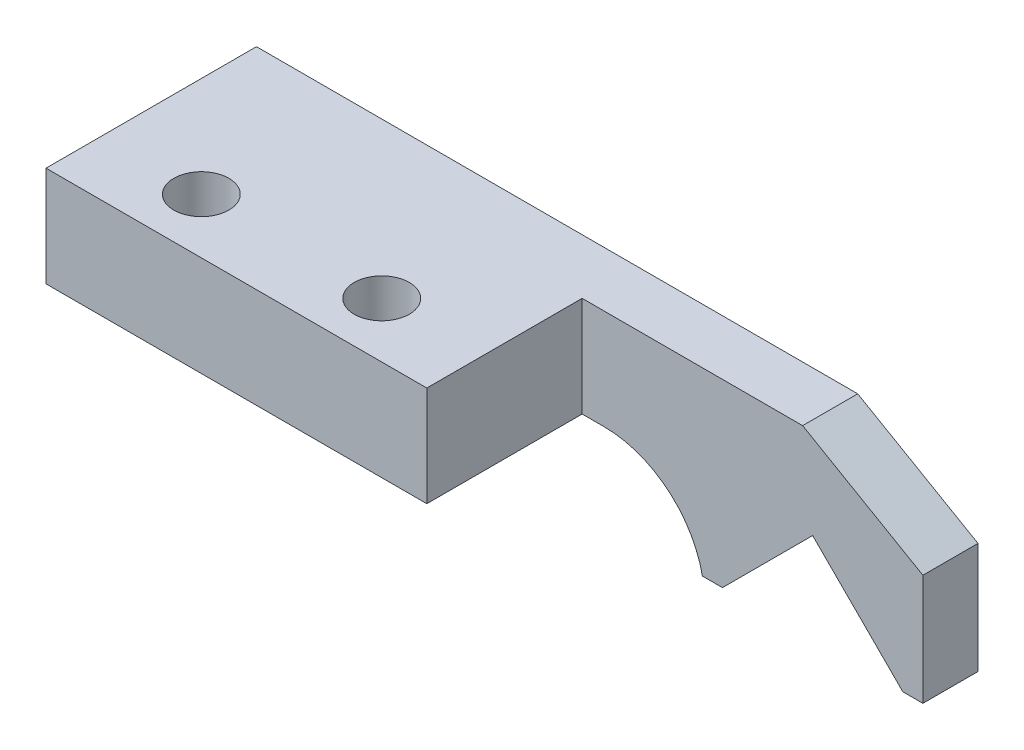
ISO-10303-21;
HEADER;
FILE_DESCRIPTION(('STEP AP214'),'2;1');
FILE_NAME('part.step','',(''),(''),'','','');
FILE_SCHEMA(('AUTOMOTIVE_DESIGN { 1 0 10303 214 1 1 1 1 }'));
ENDSEC;
DATA;
#1=APPLICATION_CONTEXT('core data for automotive mechanical design processes');
#2=APPLICATION_PROTOCOL_DEFINITION('international standard','automotive_design',2000,#1);
#3=PRODUCT_CONTEXT('',#1,'mechanical');
#4=PRODUCT('Part','Part','',(#3));
#5=PRODUCT_RELATED_PRODUCT_CATEGORY('part','',(#4));
#6=PRODUCT_DEFINITION_FORMATION('','',#4);
#7=PRODUCT_DEFINITION_CONTEXT('part definition',#1,'design');
#8=PRODUCT_DEFINITION('design','',#6,#7);
#9=PRODUCT_DEFINITION_SHAPE('','',#8);
#10=(LENGTH_UNIT() NAMED_UNIT(*) SI_UNIT(.MILLI.,.METRE.));
#11=(NAMED_UNIT(*) PLANE_ANGLE_UNIT() SI_UNIT($,.RADIAN.));
#12=(NAMED_UNIT(*) SI_UNIT($,.STERADIAN.) SOLID_ANGLE_UNIT());
#13=UNCERTAINTY_MEASURE_WITH_UNIT(LENGTH_MEASURE(1.E-05),#10,'distance_accuracy_value','');
#14=(GEOMETRIC_REPRESENTATION_CONTEXT(3) GLOBAL_UNCERTAINTY_ASSIGNED_CONTEXT((#13)) GLOBAL_UNIT_ASSIGNED_CONTEXT((#10,
#11,#12)) REPRESENTATION_CONTEXT('',''));
#15=CARTESIAN_POINT('',(0.,0.,0.));
#16=DIRECTION('',(0.,0.,1.));
#17=DIRECTION('',(1.,0.,0.));
#18=AXIS2_PLACEMENT_3D('',#15,#16,#17);
#19=CARTESIAN_POINT('',(40.2020410288673,-10.,21.));
#20=DIRECTION('',(0.,0.,-1.));
#21=DIRECTION('',(-1.,0.,0.));
#22=AXIS2_PLACEMENT_3D('',#19,#20,#21);
#23=CYLINDRICAL_SURFACE('',#22,10.);
#24=DIRECTION('',(0.,0.,-1.));
#25=VECTOR('',#24,1.);
#26=CARTESIAN_POINT('',(50.,-8.,21.));
#27=LINE('',#26,#25);
#28=CARTESIAN_POINT('',(50.,-8.,5.5));
#29=VERTEX_POINT('',#28);
#30=CARTESIAN_POINT('',(50.,-8.,0.));
#31=VERTEX_POINT('',#30);
#32=EDGE_CURVE('E199',#29,#31,#27,.T.);
#33=ORIENTED_EDGE('',*,*,#32,.F.);
#34=CARTESIAN_POINT('',(40.2020410288673,-10.,5.5));
#35=DIRECTION('',(0.,0.,1.));
#36=DIRECTION('',(1.,0.,0.));
#37=AXIS2_PLACEMENT_3D('',#34,#35,#36);
#38=CIRCLE('',#37,10.);
#39=CARTESIAN_POINT('',(40.2020410288673,0.,5.5));
#40=VERTEX_POINT('',#39);
#41=EDGE_CURVE('E156',#29,#40,#38,.T.);
#42=ORIENTED_EDGE('',*,*,#41,.T.);
#43=DIRECTION('',(0.,0.,-1.));
#44=VECTOR('',#43,1.);
#45=CARTESIAN_POINT('',(40.2020410288673,0.,21.));
#46=LINE('',#45,#44);
#47=CARTESIAN_POINT('',(40.2020410288673,0.,0.));
#48=VERTEX_POINT('',#47);
#49=EDGE_CURVE('E40',#40,#48,#46,.T.);
#50=ORIENTED_EDGE('',*,*,#49,.T.);
#51=CARTESIAN_POINT('',(40.2020410288673,-10.,0.));
#52=DIRECTION('',(0.,0.,1.));
#53=DIRECTION('',(1.,0.,0.));
#54=AXIS2_PLACEMENT_3D('',#51,#52,#53);
#55=CIRCLE('',#54,10.);
#56=EDGE_CURVE('E188',#31,#48,#55,.T.);
#57=ORIENTED_EDGE('',*,*,#56,.F.);
#58=EDGE_LOOP('',(#33,#42,#50,#57));
#59=FACE_BOUND('',#58,.T.);
#60=ADVANCED_FACE('F32',(#59),#23,.F.);
#61=CARTESIAN_POINT('',(52.,-8.,21.));
#62=DIRECTION('',(0.,-1.,0.));
#63=DIRECTION('',(0.,0.,-1.));
#64=AXIS2_PLACEMENT_3D('',#61,#62,#63);
#65=PLANE('',#64);
#66=DIRECTION('',(0.,0.,-1.));
#67=VECTOR('',#66,1.);
#68=CARTESIAN_POINT('',(52.,-8.,21.));
#69=LINE('',#68,#67);
#70=CARTESIAN_POINT('',(52.,-8.,5.5));
#71=VERTEX_POINT('',#70);
#72=CARTESIAN_POINT('',(52.,-8.,0.));
#73=VERTEX_POINT('',#72);
#74=EDGE_CURVE('E201',#71,#73,#69,.T.);
#75=ORIENTED_EDGE('',*,*,#74,.F.);
#76=DIRECTION('',(1.,0.,0.));
#77=VECTOR('',#76,1.);
#78=CARTESIAN_POINT('',(38.,-8.,5.5));
#79=LINE('',#78,#77);
#80=EDGE_CURVE('E126',#29,#71,#79,.T.);
#81=ORIENTED_EDGE('',*,*,#80,.F.);
#82=ORIENTED_EDGE('',*,*,#32,.T.);
#83=DIRECTION('',(-1.,0.,0.));
#84=VECTOR('',#83,1.);
#85=CARTESIAN_POINT('',(52.,-8.,0.));
#86=LINE('',#85,#84);
#87=EDGE_CURVE('E185',#73,#31,#86,.T.);
#88=ORIENTED_EDGE('',*,*,#87,.F.);
#89=EDGE_LOOP('',(#75,#81,#82,#88));
#90=FACE_BOUND('',#89,.T.);
#91=ADVANCED_FACE('F233',(#90),#65,.T.);
#92=CARTESIAN_POINT('',(52.,-8.,21.));
#93=DIRECTION('',(-0.707106781186544,0.707106781186551,0.));
#94=DIRECTION('',(-0.707106781186551,-0.707106781186544,0.));
#95=AXIS2_PLACEMENT_3D('',#92,#93,#94);
#96=PLANE('',#95);
#97=DIRECTION('',(0.707106781186551,0.707106781186544,0.));
#98=VECTOR('',#97,1.);
#99=CARTESIAN_POINT('',(52.,-8.,5.5));
#100=LINE('',#99,#98);
#101=CARTESIAN_POINT('',(61.0000000000001,0.999999999999963,5.5));
#102=VERTEX_POINT('',#101);
#103=EDGE_CURVE('E154',#71,#102,#100,.T.);
#104=ORIENTED_EDGE('',*,*,#103,.F.);
#105=ORIENTED_EDGE('',*,*,#74,.T.);
#106=DIRECTION('',(0.707106781186551,0.707106781186544,0.));
#107=VECTOR('',#106,1.);
#108=CARTESIAN_POINT('',(52.,-8.,0.));
#109=LINE('',#108,#107);
#110=CARTESIAN_POINT('',(61.0000000000001,0.999999999999963,0.));
#111=VERTEX_POINT('',#110);
#112=EDGE_CURVE('E182',#73,#111,#109,.T.);
#113=ORIENTED_EDGE('',*,*,#112,.T.);
#114=DIRECTION('',(0.,0.,-1.));
#115=VECTOR('',#114,1.);
#116=CARTESIAN_POINT('',(61.0000000000001,0.999999999999963,21.));
#117=LINE('',#116,#115);
#118=EDGE_CURVE('E203',#102,#111,#117,.T.);
#119=ORIENTED_EDGE('',*,*,#118,.F.);
#120=EDGE_LOOP('',(#104,#105,#113,#119));
#121=FACE_BOUND('',#120,.T.);
#122=ADVANCED_FACE('F235',(#121),#96,.F.);
#123=CARTESIAN_POINT('',(70.,-8.,21.));
#124=DIRECTION('',(-0.707106781186549,-0.707106781186546,0.));
#125=DIRECTION('',(0.707106781186546,-0.707106781186549,0.));
#126=AXIS2_PLACEMENT_3D('',#123,#124,#125);
#127=PLANE('',#126);
#128=DIRECTION('',(0.,0.,-1.));
#129=VECTOR('',#128,1.);
#130=CARTESIAN_POINT('',(70.,-8.,21.));
#131=LINE('',#130,#129);
#132=CARTESIAN_POINT('',(70.,-8.,5.5));
#133=VERTEX_POINT('',#132);
#134=CARTESIAN_POINT('',(70.,-8.,0.));
#135=VERTEX_POINT('',#134);
#136=EDGE_CURVE('E205',#133,#135,#131,.T.);
#137=ORIENTED_EDGE('',*,*,#136,.F.);
#138=DIRECTION('',(-0.707106781186546,0.707106781186549,0.));
#139=VECTOR('',#138,1.);
#140=CARTESIAN_POINT('',(70.,-8.00000000000001,5.5));
#141=LINE('',#140,#139);
#142=EDGE_CURVE('E151',#133,#102,#141,.T.);
#143=ORIENTED_EDGE('',*,*,#142,.T.);
#144=ORIENTED_EDGE('',*,*,#118,.T.);
#145=DIRECTION('',(-0.707106781186546,0.707106781186549,0.));
#146=VECTOR('',#145,1.);
#147=CARTESIAN_POINT('',(70.,-8.,0.));
#148=LINE('',#147,#146);
#149=EDGE_CURVE('E179',#135,#111,#148,.T.);
#150=ORIENTED_EDGE('',*,*,#149,.F.);
#151=EDGE_LOOP('',(#137,#143,#144,#150));
#152=FACE_BOUND('',#151,.T.);
#153=ADVANCED_FACE('F241',(#152),#127,.T.);
#154=CARTESIAN_POINT('',(72.,-8.,21.));
#155=DIRECTION('',(0.,-1.,0.));
#156=DIRECTION('',(0.,0.,-1.));
#157=AXIS2_PLACEMENT_3D('',#154,#155,#156);
#158=PLANE('',#157);
#159=DIRECTION('',(0.,0.,-1.));
#160=VECTOR('',#159,1.);
#161=CARTESIAN_POINT('',(72.,-8.,21.));
#162=LINE('',#161,#160);
#163=CARTESIAN_POINT('',(72.,-8.,5.5));
#164=VERTEX_POINT('',#163);
#165=CARTESIAN_POINT('',(72.,-8.,0.));
#166=VERTEX_POINT('',#165);
#167=EDGE_CURVE('E207',#164,#166,#162,.T.);
#168=ORIENTED_EDGE('',*,*,#167,.F.);
#169=EDGE_CURVE('E134',#133,#164,#79,.T.);
#170=ORIENTED_EDGE('',*,*,#169,.F.);
#171=ORIENTED_EDGE('',*,*,#136,.T.);
#172=DIRECTION('',(-1.,0.,0.));
#173=VECTOR('',#172,1.);
#174=CARTESIAN_POINT('',(72.,-8.,0.));
#175=LINE('',#174,#173);
#176=EDGE_CURVE('E176',#166,#135,#175,.T.);
#177=ORIENTED_EDGE('',*,*,#176,.F.);
#178=EDGE_LOOP('',(#168,#170,#171,#177));
#179=FACE_BOUND('',#178,.T.);
#180=ADVANCED_FACE('F245',(#179),#158,.T.);
#181=CARTESIAN_POINT('',(72.,3.07179676972449,21.));
#182=DIRECTION('',(1.,0.,0.));
#183=DIRECTION('',(0.,1.,0.));
#184=AXIS2_PLACEMENT_3D('',#181,#182,#183);
#185=PLANE('',#184);
#186=DIRECTION('',(0.,0.,-1.));
#187=VECTOR('',#186,1.);
#188=CARTESIAN_POINT('',(72.,3.07179676972449,21.));
#189=LINE('',#188,#187);
#190=CARTESIAN_POINT('',(72.,3.07179676972448,5.50000000000001));
#191=VERTEX_POINT('',#190);
#192=CARTESIAN_POINT('',(72.,3.07179676972449,0.));
#193=VERTEX_POINT('',#192);
#194=EDGE_CURVE('E209',#191,#193,#189,.T.);
#195=ORIENTED_EDGE('',*,*,#194,.F.);
#196=DIRECTION('',(0.,-1.,0.));
#197=VECTOR('',#196,1.);
#198=CARTESIAN_POINT('',(72.,3.07179676972449,5.5));
#199=LINE('',#198,#197);
#200=EDGE_CURVE('E148',#191,#164,#199,.T.);
#201=ORIENTED_EDGE('',*,*,#200,.T.);
#202=ORIENTED_EDGE('',*,*,#167,.T.);
#203=DIRECTION('',(0.,-1.,0.));
#204=VECTOR('',#203,1.);
#205=CARTESIAN_POINT('',(72.,3.07179676972449,0.));
#206=LINE('',#205,#204);
#207=EDGE_CURVE('E173',#193,#166,#206,.T.);
#208=ORIENTED_EDGE('',*,*,#207,.F.);
#209=EDGE_LOOP('',(#195,#201,#202,#208));
#210=FACE_BOUND('',#209,.T.);
#211=ADVANCED_FACE('F249',(#210),#185,.T.);
#212=CARTESIAN_POINT('',(60.,10.,21.));
#213=DIRECTION('',(0.500000000000001,0.866025403784438,0.));
#214=DIRECTION('',(-0.866025403784438,0.500000000000001,0.));
#215=AXIS2_PLACEMENT_3D('',#212,#213,#214);
#216=PLANE('',#215);
#217=DIRECTION('',(0.,0.,-1.));
#218=VECTOR('',#217,1.);
#219=CARTESIAN_POINT('',(60.,10.,21.));
#220=LINE('',#219,#218);
#221=CARTESIAN_POINT('',(60.,10.,5.5));
#222=VERTEX_POINT('',#221);
#223=CARTESIAN_POINT('',(60.,10.,0.));
#224=VERTEX_POINT('',#223);
#225=EDGE_CURVE('E211',#222,#224,#220,.T.);
#226=ORIENTED_EDGE('',*,*,#225,.F.);
#227=DIRECTION('',(0.866025403784438,-0.500000000000001,0.));
#228=VECTOR('',#227,1.);
#229=CARTESIAN_POINT('',(60.,10.,5.5));
#230=LINE('',#229,#228);
#231=EDGE_CURVE('E132',#222,#191,#230,.T.);
#232=ORIENTED_EDGE('',*,*,#231,.T.);
#233=ORIENTED_EDGE('',*,*,#194,.T.);
#234=DIRECTION('',(0.866025403784438,-0.500000000000001,0.));
#235=VECTOR('',#234,1.);
#236=CARTESIAN_POINT('',(60.,10.,0.));
#237=LINE('',#236,#235);
#238=EDGE_CURVE('E170',#224,#193,#237,.T.);
#239=ORIENTED_EDGE('',*,*,#238,.F.);
#240=EDGE_LOOP('',(#226,#232,#233,#239));
#241=FACE_BOUND('',#240,.T.);
#242=ADVANCED_FACE('F251',(#241),#216,.T.);
#243=CARTESIAN_POINT('',(40.2020410288673,0.,21.));
#244=DIRECTION('',(0.,-1.,0.));
#245=DIRECTION('',(0.,0.,-1.));
#246=AXIS2_PLACEMENT_3D('',#243,#244,#245);
#247=PLANE('',#246);
#248=CARTESIAN_POINT('',(10.,0.,15.5));
#249=DIRECTION('',(0.,-1.,0.));
#250=DIRECTION('',(0.,0.,-1.));
#251=AXIS2_PLACEMENT_3D('',#248,#249,#250);
#252=CIRCLE('',#251,5.);
#253=CARTESIAN_POINT('',(10.,0.,10.5));
#254=VERTEX_POINT('',#253);
#255=EDGE_CURVE('E443',#254,#254,#252,.T.);
#256=ORIENTED_EDGE('',*,*,#255,.F.);
#257=EDGE_LOOP('',(#256));
#258=FACE_BOUND('',#257,.T.);
#259=CARTESIAN_POINT('',(28.,0.,15.5));
#260=DIRECTION('',(0.,-1.,0.));
#261=DIRECTION('',(0.,0.,-1.));
#262=AXIS2_PLACEMENT_3D('',#259,#260,#261);
#263=CIRCLE('',#262,5.);
#264=CARTESIAN_POINT('',(28.,0.,10.5));
#265=VERTEX_POINT('',#264);
#266=EDGE_CURVE('E141',#265,#265,#263,.T.);
#267=ORIENTED_EDGE('',*,*,#266,.F.);
#268=EDGE_LOOP('',(#267));
#269=FACE_BOUND('',#268,.T.);
#270=DIRECTION('',(0.,0.,-1.));
#271=VECTOR('',#270,1.);
#272=CARTESIAN_POINT('',(38.,0.,21.));
#273=LINE('',#272,#271);
#274=CARTESIAN_POINT('',(38.,0.,21.));
#275=VERTEX_POINT('',#274);
#276=CARTESIAN_POINT('',(38.,0.,5.5));
#277=VERTEX_POINT('',#276);
#278=EDGE_CURVE('E123',#275,#277,#273,.T.);
#279=ORIENTED_EDGE('',*,*,#278,.F.);
#280=DIRECTION('',(-1.,0.,0.));
#281=VECTOR('',#280,1.);
#282=CARTESIAN_POINT('',(40.2020410288673,0.,21.));
#283=LINE('',#282,#281);
#284=CARTESIAN_POINT('',(0.,0.,21.));
#285=VERTEX_POINT('',#284);
#286=EDGE_CURVE('E191',#275,#285,#283,.T.);
#287=ORIENTED_EDGE('',*,*,#286,.T.);
#288=DIRECTION('',(0.,0.,-1.));
#289=VECTOR('',#288,1.);
#290=CARTESIAN_POINT('',(0.,0.,21.));
#291=LINE('',#290,#289);
#292=CARTESIAN_POINT('',(0.,0.,0.));
#293=VERTEX_POINT('',#292);
#294=EDGE_CURVE('E197',#285,#293,#291,.T.);
#295=ORIENTED_EDGE('',*,*,#294,.T.);
#296=DIRECTION('',(-1.,0.,0.));
#297=VECTOR('',#296,1.);
#298=CARTESIAN_POINT('',(40.2020410288673,0.,0.));
#299=LINE('',#298,#297);
#300=EDGE_CURVE('E161',#48,#293,#299,.T.);
#301=ORIENTED_EDGE('',*,*,#300,.F.);
#302=ORIENTED_EDGE('',*,*,#49,.F.);
#303=DIRECTION('',(-1.,0.,0.));
#304=VECTOR('',#303,1.);
#305=CARTESIAN_POINT('',(40.2020410288673,0.,5.5));
#306=LINE('',#305,#304);
#307=EDGE_CURVE('E159',#40,#277,#306,.T.);
#308=ORIENTED_EDGE('',*,*,#307,.T.);
#309=EDGE_LOOP('',(#279,#287,#295,#301,#302,#308));
#310=FACE_BOUND('',#309,.T.);
#311=ADVANCED_FACE('F34',(#258,#269,#310),#247,.T.);
#312=CARTESIAN_POINT('',(0.,10.,21.));
#313=DIRECTION('',(0.,1.,0.));
#314=DIRECTION('',(0.,0.,1.));
#315=AXIS2_PLACEMENT_3D('',#312,#313,#314);
#316=PLANE('',#315);
#317=CARTESIAN_POINT('',(10.,10.,15.5));
#318=DIRECTION('',(0.,1.,0.));
#319=DIRECTION('',(0.,0.,1.));
#320=AXIS2_PLACEMENT_3D('',#317,#318,#319);
#321=CIRCLE('',#320,2.75);
#322=CARTESIAN_POINT('',(10.,10.,18.25));
#323=VERTEX_POINT('',#322);
#324=EDGE_CURVE('E430',#323,#323,#321,.T.);
#325=ORIENTED_EDGE('',*,*,#324,.F.);
#326=EDGE_LOOP('',(#325));
#327=FACE_BOUND('',#326,.T.);
#328=CARTESIAN_POINT('',(28.,10.,15.5));
#329=DIRECTION('',(0.,1.,0.));
#330=DIRECTION('',(0.,0.,1.));
#331=AXIS2_PLACEMENT_3D('',#328,#329,#330);
#332=CIRCLE('',#331,2.75);
#333=CARTESIAN_POINT('',(28.,10.,18.25));
#334=VERTEX_POINT('',#333);
#335=EDGE_CURVE('E440',#334,#334,#332,.T.);
#336=ORIENTED_EDGE('',*,*,#335,.F.);
#337=EDGE_LOOP('',(#336));
#338=FACE_BOUND('',#337,.T.);
#339=DIRECTION('',(0.,0.,1.));
#340=VECTOR('',#339,1.);
#341=CARTESIAN_POINT('',(38.,10.,5.5));
#342=LINE('',#341,#340);
#343=CARTESIAN_POINT('',(38.,10.,5.5));
#344=VERTEX_POINT('',#343);
#345=CARTESIAN_POINT('',(38.,10.,21.));
#346=VERTEX_POINT('',#345);
#347=EDGE_CURVE('E46',#344,#346,#342,.T.);
#348=ORIENTED_EDGE('',*,*,#347,.F.);
#349=DIRECTION('',(1.,0.,0.));
#350=VECTOR('',#349,1.);
#351=CARTESIAN_POINT('',(38.,10.,5.5));
#352=LINE('',#351,#350);
#353=EDGE_CURVE('E129',#344,#222,#352,.T.);
#354=ORIENTED_EDGE('',*,*,#353,.T.);
#355=ORIENTED_EDGE('',*,*,#225,.T.);
#356=DIRECTION('',(1.,0.,0.));
#357=VECTOR('',#356,1.);
#358=CARTESIAN_POINT('',(0.,10.,0.));
#359=LINE('',#358,#357);
#360=CARTESIAN_POINT('',(0.,10.,0.));
#361=VERTEX_POINT('',#360);
#362=EDGE_CURVE('E167',#361,#224,#359,.T.);
#363=ORIENTED_EDGE('',*,*,#362,.F.);
#364=DIRECTION('',(0.,0.,-1.));
#365=VECTOR('',#364,1.);
#366=CARTESIAN_POINT('',(0.,10.,21.));
#367=LINE('',#366,#365);
#368=CARTESIAN_POINT('',(0.,10.,21.));
#369=VERTEX_POINT('',#368);
#370=EDGE_CURVE('E54',#369,#361,#367,.T.);
#371=ORIENTED_EDGE('',*,*,#370,.F.);
#372=DIRECTION('',(1.,0.,0.));
#373=VECTOR('',#372,1.);
#374=CARTESIAN_POINT('',(0.,10.,21.));
#375=LINE('',#374,#373);
#376=EDGE_CURVE('E137',#369,#346,#375,.T.);
#377=ORIENTED_EDGE('',*,*,#376,.T.);
#378=EDGE_LOOP('',(#348,#354,#355,#363,#371,#377));
#379=FACE_BOUND('',#378,.T.);
#380=ADVANCED_FACE('F136',(#327,#338,#379),#316,.T.);
#381=CARTESIAN_POINT('',(0.,0.,21.));
#382=DIRECTION('',(-1.,0.,0.));
#383=DIRECTION('',(0.,0.,1.));
#384=AXIS2_PLACEMENT_3D('',#381,#382,#383);
#385=PLANE('',#384);
#386=DIRECTION('',(0.,1.,0.));
#387=VECTOR('',#386,1.);
#388=CARTESIAN_POINT('',(0.,0.,0.));
#389=LINE('',#388,#387);
#390=EDGE_CURVE('E164',#293,#361,#389,.T.);
#391=ORIENTED_EDGE('',*,*,#390,.F.);
#392=ORIENTED_EDGE('',*,*,#294,.F.);
#393=DIRECTION('',(0.,1.,0.));
#394=VECTOR('',#393,1.);
#395=CARTESIAN_POINT('',(0.,0.,21.));
#396=LINE('',#395,#394);
#397=EDGE_CURVE('E193',#285,#369,#396,.T.);
#398=ORIENTED_EDGE('',*,*,#397,.T.);
#399=ORIENTED_EDGE('',*,*,#370,.T.);
#400=EDGE_LOOP('',(#391,#392,#398,#399));
#401=FACE_BOUND('',#400,.T.);
#402=ADVANCED_FACE('F221',(#401),#385,.T.);
#403=CARTESIAN_POINT('',(40.2020410288673,-10.,21.));
#404=DIRECTION('',(0.,0.,1.));
#405=DIRECTION('',(1.,0.,0.));
#406=AXIS2_PLACEMENT_3D('',#403,#404,#405);
#407=PLANE('',#406);
#408=DIRECTION('',(0.,-1.,0.));
#409=VECTOR('',#408,1.);
#410=CARTESIAN_POINT('',(38.,-10.,21.));
#411=LINE('',#410,#409);
#412=EDGE_CURVE('E11',#346,#275,#411,.T.);
#413=ORIENTED_EDGE('',*,*,#412,.F.);
#414=ORIENTED_EDGE('',*,*,#376,.F.);
#415=ORIENTED_EDGE('',*,*,#397,.F.);
#416=ORIENTED_EDGE('',*,*,#286,.F.);
#417=EDGE_LOOP('',(#413,#414,#415,#416));
#418=FACE_BOUND('',#417,.T.);
#419=ADVANCED_FACE('F269',(#418),#407,.T.);
#420=CARTESIAN_POINT('',(40.2020410288673,-10.,0.));
#421=DIRECTION('',(0.,0.,1.));
#422=DIRECTION('',(1.,0.,0.));
#423=AXIS2_PLACEMENT_3D('',#420,#421,#422);
#424=PLANE('',#423);
#425=ORIENTED_EDGE('',*,*,#300,.T.);
#426=ORIENTED_EDGE('',*,*,#390,.T.);
#427=ORIENTED_EDGE('',*,*,#362,.T.);
#428=ORIENTED_EDGE('',*,*,#238,.T.);
#429=ORIENTED_EDGE('',*,*,#207,.T.);
#430=ORIENTED_EDGE('',*,*,#176,.T.);
#431=ORIENTED_EDGE('',*,*,#149,.T.);
#432=ORIENTED_EDGE('',*,*,#112,.F.);
#433=ORIENTED_EDGE('',*,*,#87,.T.);
#434=ORIENTED_EDGE('',*,*,#56,.T.);
#435=EDGE_LOOP('',(#425,#426,#427,#428,#429,#430,#431,#432,#433,#434));
#436=FACE_BOUND('',#435,.T.);
#437=ADVANCED_FACE('F223',(#436),#424,.F.);
#438=CARTESIAN_POINT('',(38.,-8.,5.5));
#439=DIRECTION('',(0.,0.,1.));
#440=DIRECTION('',(1.,0.,0.));
#441=AXIS2_PLACEMENT_3D('',#438,#439,#440);
#442=PLANE('',#441);
#443=ORIENTED_EDGE('',*,*,#41,.F.);
#444=ORIENTED_EDGE('',*,*,#80,.T.);
#445=ORIENTED_EDGE('',*,*,#103,.T.);
#446=ORIENTED_EDGE('',*,*,#142,.F.);
#447=ORIENTED_EDGE('',*,*,#169,.T.);
#448=ORIENTED_EDGE('',*,*,#200,.F.);
#449=ORIENTED_EDGE('',*,*,#231,.F.);
#450=ORIENTED_EDGE('',*,*,#353,.F.);
#451=DIRECTION('',(0.,1.,0.));
#452=VECTOR('',#451,1.);
#453=CARTESIAN_POINT('',(38.,-8.,5.5));
#454=LINE('',#453,#452);
#455=EDGE_CURVE('E119',#277,#344,#454,.T.);
#456=ORIENTED_EDGE('',*,*,#455,.F.);
#457=ORIENTED_EDGE('',*,*,#307,.F.);
#458=EDGE_LOOP('',(#443,#444,#445,#446,#447,#448,#449,#450,#456,#457));
#459=FACE_BOUND('',#458,.T.);
#460=ADVANCED_FACE('F130',(#459),#442,.T.);
#461=CARTESIAN_POINT('',(38.,-8.,5.5));
#462=DIRECTION('',(-1.,0.,0.));
#463=DIRECTION('',(0.,0.,1.));
#464=AXIS2_PLACEMENT_3D('',#461,#462,#463);
#465=PLANE('',#464);
#466=ORIENTED_EDGE('',*,*,#278,.T.);
#467=ORIENTED_EDGE('',*,*,#455,.T.);
#468=ORIENTED_EDGE('',*,*,#347,.T.);
#469=ORIENTED_EDGE('',*,*,#412,.T.);
#470=EDGE_LOOP('',(#466,#467,#468,#469));
#471=FACE_BOUND('',#470,.T.);
#472=ADVANCED_FACE('F121',(#471),#465,.F.);
#473=CARTESIAN_POINT('',(28.,6.,15.5));
#474=DIRECTION('',(0.,-1.,0.));
#475=DIRECTION('',(0.,0.,-1.));
#476=AXIS2_PLACEMENT_3D('',#473,#474,#475);
#477=CYLINDRICAL_SURFACE('',#476,5.);
#478=CARTESIAN_POINT('',(28.,6.,15.5));
#479=DIRECTION('',(0.,-1.,0.));
#480=DIRECTION('',(0.,0.,-1.));
#481=AXIS2_PLACEMENT_3D('',#478,#479,#480);
#482=CIRCLE('',#481,5.);
#483=CARTESIAN_POINT('',(28.,6.,10.5));
#484=VERTEX_POINT('',#483);
#485=EDGE_CURVE('E138',#484,#484,#482,.T.);
#486=ORIENTED_EDGE('',*,*,#485,.F.);
#487=EDGE_LOOP('',(#486));
#488=FACE_BOUND('',#487,.T.);
#489=ORIENTED_EDGE('',*,*,#266,.T.);
#490=EDGE_LOOP('',(#489));
#491=FACE_BOUND('',#490,.T.);
#492=ADVANCED_FACE('F319',(#488,#491),#477,.F.);
#493=CARTESIAN_POINT('',(28.,6.,15.5));
#494=DIRECTION('',(0.,-1.,0.));
#495=DIRECTION('',(0.,0.,-1.));
#496=AXIS2_PLACEMENT_3D('',#493,#494,#495);
#497=PLANE('',#496);
#498=CARTESIAN_POINT('',(28.,6.,15.5));
#499=DIRECTION('',(0.,-1.,0.));
#500=DIRECTION('',(0.,0.,-1.));
#501=AXIS2_PLACEMENT_3D('',#498,#499,#500);
#502=CIRCLE('',#501,2.75);
#503=CARTESIAN_POINT('',(28.,6.,12.75));
#504=VERTEX_POINT('',#503);
#505=EDGE_CURVE('E435',#504,#504,#502,.T.);
#506=ORIENTED_EDGE('',*,*,#505,.F.);
#507=EDGE_LOOP('',(#506));
#508=FACE_BOUND('',#507,.T.);
#509=ORIENTED_EDGE('',*,*,#485,.T.);
#510=EDGE_LOOP('',(#509));
#511=FACE_BOUND('',#510,.T.);
#512=ADVANCED_FACE('F336',(#508,#511),#497,.T.);
#513=CARTESIAN_POINT('',(10.,6.,15.5));
#514=DIRECTION('',(0.,-1.,0.));
#515=DIRECTION('',(0.,0.,-1.));
#516=AXIS2_PLACEMENT_3D('',#513,#514,#515);
#517=CYLINDRICAL_SURFACE('',#516,5.);
#518=CARTESIAN_POINT('',(10.,6.,15.5));
#519=DIRECTION('',(0.,-1.,0.));
#520=DIRECTION('',(0.,0.,-1.));
#521=AXIS2_PLACEMENT_3D('',#518,#519,#520);
#522=CIRCLE('',#521,5.);
#523=CARTESIAN_POINT('',(10.,6.,10.5));
#524=VERTEX_POINT('',#523);
#525=EDGE_CURVE('E446',#524,#524,#522,.T.);
#526=ORIENTED_EDGE('',*,*,#525,.F.);
#527=EDGE_LOOP('',(#526));
#528=FACE_BOUND('',#527,.T.);
#529=ORIENTED_EDGE('',*,*,#255,.T.);
#530=EDGE_LOOP('',(#529));
#531=FACE_BOUND('',#530,.T.);
#532=ADVANCED_FACE('F344',(#528,#531),#517,.F.);
#533=CARTESIAN_POINT('',(10.,6.,15.5));
#534=DIRECTION('',(0.,-1.,0.));
#535=DIRECTION('',(0.,0.,-1.));
#536=AXIS2_PLACEMENT_3D('',#533,#534,#535);
#537=PLANE('',#536);
#538=CARTESIAN_POINT('',(10.,6.,15.5));
#539=DIRECTION('',(0.,-1.,0.));
#540=DIRECTION('',(0.,0.,-1.));
#541=AXIS2_PLACEMENT_3D('',#538,#539,#540);
#542=CIRCLE('',#541,2.75);
#543=CARTESIAN_POINT('',(10.,6.,12.75));
#544=VERTEX_POINT('',#543);
#545=EDGE_CURVE('E433',#544,#544,#542,.T.);
#546=ORIENTED_EDGE('',*,*,#545,.F.);
#547=EDGE_LOOP('',(#546));
#548=FACE_BOUND('',#547,.T.);
#549=ORIENTED_EDGE('',*,*,#525,.T.);
#550=EDGE_LOOP('',(#549));
#551=FACE_BOUND('',#550,.T.);
#552=ADVANCED_FACE('F349',(#548,#551),#537,.T.);
#553=CARTESIAN_POINT('',(28.,12.,15.5));
#554=DIRECTION('',(0.,-1.,0.));
#555=DIRECTION('',(0.,0.,-1.));
#556=AXIS2_PLACEMENT_3D('',#553,#554,#555);
#557=CYLINDRICAL_SURFACE('',#556,2.75);
#558=ORIENTED_EDGE('',*,*,#335,.T.);
#559=EDGE_LOOP('',(#558));
#560=FACE_BOUND('',#559,.T.);
#561=ORIENTED_EDGE('',*,*,#505,.T.);
#562=EDGE_LOOP('',(#561));
#563=FACE_BOUND('',#562,.T.);
#564=ADVANCED_FACE('F372',(#560,#563),#557,.F.);
#565=CARTESIAN_POINT('',(10.,12.,15.5));
#566=DIRECTION('',(0.,-1.,0.));
#567=DIRECTION('',(0.,0.,-1.));
#568=AXIS2_PLACEMENT_3D('',#565,#566,#567);
#569=CYLINDRICAL_SURFACE('',#568,2.75);
#570=ORIENTED_EDGE('',*,*,#324,.T.);
#571=EDGE_LOOP('',(#570));
#572=FACE_BOUND('',#571,.T.);
#573=ORIENTED_EDGE('',*,*,#545,.T.);
#574=EDGE_LOOP('',(#573));
#575=FACE_BOUND('',#574,.T.);
#576=ADVANCED_FACE('F382',(#572,#575),#569,.F.);
#577=CLOSED_SHELL('',(#60,#91,#122,#153,#180,#211,#242,#311,#380,#402,#419,#437,#460,#472,#492,
#512,#532,#552,#564,#576));
#578=MANIFOLD_SOLID_BREP('B2',#577);
#579=ADVANCED_BREP_SHAPE_REPRESENTATION('',(#18,#578),#14);
#580=SHAPE_DEFINITION_REPRESENTATION(#9,#579);
ENDSEC;
END-ISO-10303-21;
